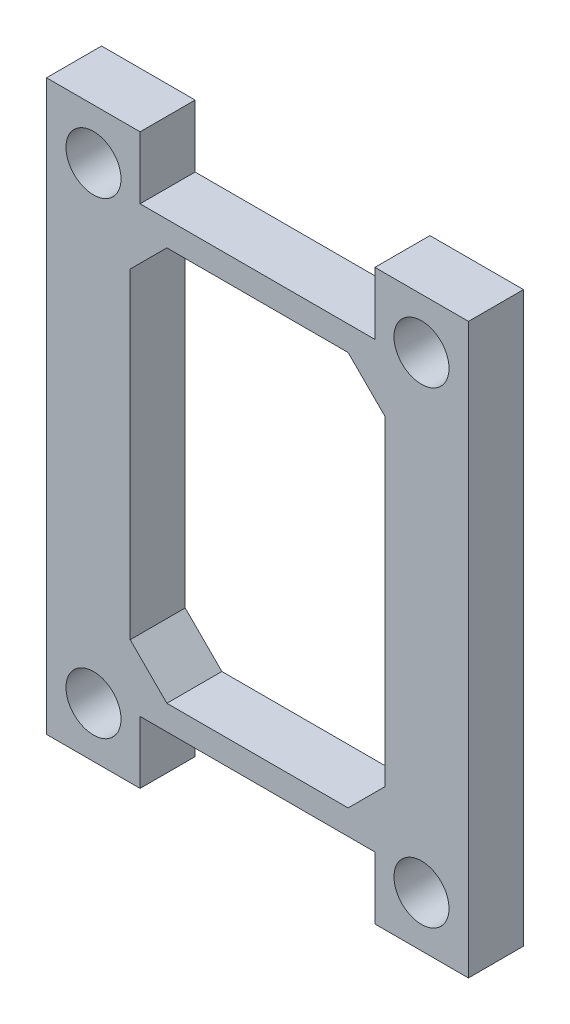
ISO-10303-21;
HEADER;
FILE_DESCRIPTION(('STEP AP214'),'2;1');
FILE_NAME('part.step','',(''),(''),'','','');
FILE_SCHEMA(('AUTOMOTIVE_DESIGN { 1 0 10303 214 1 1 1 1 }'));
ENDSEC;
DATA;
#1=APPLICATION_CONTEXT('core data for automotive mechanical design processes');
#2=APPLICATION_PROTOCOL_DEFINITION('international standard','automotive_design',2000,#1);
#3=PRODUCT_CONTEXT('',#1,'mechanical');
#4=PRODUCT('Part','Part','',(#3));
#5=PRODUCT_RELATED_PRODUCT_CATEGORY('part','',(#4));
#6=PRODUCT_DEFINITION_FORMATION('','',#4);
#7=PRODUCT_DEFINITION_CONTEXT('part definition',#1,'design');
#8=PRODUCT_DEFINITION('design','',#6,#7);
#9=PRODUCT_DEFINITION_SHAPE('','',#8);
#10=(LENGTH_UNIT() NAMED_UNIT(*) SI_UNIT(.MILLI.,.METRE.));
#11=(NAMED_UNIT(*) PLANE_ANGLE_UNIT() SI_UNIT($,.RADIAN.));
#12=(NAMED_UNIT(*) SI_UNIT($,.STERADIAN.) SOLID_ANGLE_UNIT());
#13=UNCERTAINTY_MEASURE_WITH_UNIT(LENGTH_MEASURE(1.E-05),#10,'distance_accuracy_value','');
#14=(GEOMETRIC_REPRESENTATION_CONTEXT(3) GLOBAL_UNCERTAINTY_ASSIGNED_CONTEXT((#13)) GLOBAL_UNIT_ASSIGNED_CONTEXT((#10,
#11,#12)) REPRESENTATION_CONTEXT('',''));
#15=CARTESIAN_POINT('',(0.,0.,0.));
#16=DIRECTION('',(0.,0.,1.));
#17=DIRECTION('',(1.,0.,0.));
#18=AXIS2_PLACEMENT_3D('',#15,#16,#17);
#19=CARTESIAN_POINT('',(11.5,-15.5,3.));
#20=DIRECTION('',(0.,0.,1.));
#21=DIRECTION('',(1.,0.,0.));
#22=AXIS2_PLACEMENT_3D('',#19,#20,#21);
#23=PLANE('',#22);
#24=DIRECTION('',(1.,0.,0.));
#25=VECTOR('',#24,1.);
#26=CARTESIAN_POINT('',(4.56,-4.75,3.));
#27=LINE('',#26,#25);
#28=CARTESIAN_POINT('',(6.56,-4.75,3.));
#29=VERTEX_POINT('',#28);
#30=CARTESIAN_POINT('',(16.44,-4.75,3.));
#31=VERTEX_POINT('',#30);
#32=EDGE_CURVE('E212',#29,#31,#27,.T.);
#33=ORIENTED_EDGE('',*,*,#32,.T.);
#34=DIRECTION('',(-0.707106781186548,0.707106781186548,0.));
#35=VECTOR('',#34,1.);
#36=CARTESIAN_POINT('',(18.3925,-6.7025,3.));
#37=LINE('',#36,#35);
#38=CARTESIAN_POINT('',(18.44,-6.75,3.));
#39=VERTEX_POINT('',#38);
#40=EDGE_CURVE('E238',#39,#31,#37,.T.);
#41=ORIENTED_EDGE('',*,*,#40,.F.);
#42=DIRECTION('',(0.,-1.,0.));
#43=VECTOR('',#42,1.);
#44=CARTESIAN_POINT('',(18.44,-4.75,3.));
#45=LINE('',#44,#43);
#46=CARTESIAN_POINT('',(18.44,-24.25,3.));
#47=VERTEX_POINT('',#46);
#48=EDGE_CURVE('E290',#39,#47,#45,.T.);
#49=ORIENTED_EDGE('',*,*,#48,.T.);
#50=DIRECTION('',(0.707106781186548,0.707106781186548,0.));
#51=VECTOR('',#50,1.);
#52=CARTESIAN_POINT('',(18.3925,-24.2975,3.));
#53=LINE('',#52,#51);
#54=CARTESIAN_POINT('',(16.44,-26.25,3.));
#55=VERTEX_POINT('',#54);
#56=EDGE_CURVE('E225',#55,#47,#53,.T.);
#57=ORIENTED_EDGE('',*,*,#56,.F.);
#58=DIRECTION('',(-1.,0.,0.));
#59=VECTOR('',#58,1.);
#60=CARTESIAN_POINT('',(18.44,-26.25,3.));
#61=LINE('',#60,#59);
#62=CARTESIAN_POINT('',(6.56,-26.25,3.));
#63=VERTEX_POINT('',#62);
#64=EDGE_CURVE('E224',#55,#63,#61,.T.);
#65=ORIENTED_EDGE('',*,*,#64,.T.);
#66=DIRECTION('',(0.707106781186547,-0.707106781186548,0.));
#67=VECTOR('',#66,1.);
#68=CARTESIAN_POINT('',(4.6075,-24.2975,3.));
#69=LINE('',#68,#67);
#70=CARTESIAN_POINT('',(4.56,-24.25,3.));
#71=VERTEX_POINT('',#70);
#72=EDGE_CURVE('E273',#71,#63,#69,.T.);
#73=ORIENTED_EDGE('',*,*,#72,.F.);
#74=DIRECTION('',(0.,1.,0.));
#75=VECTOR('',#74,1.);
#76=CARTESIAN_POINT('',(4.56,-26.25,3.));
#77=LINE('',#76,#75);
#78=CARTESIAN_POINT('',(4.56,-6.75,3.));
#79=VERTEX_POINT('',#78);
#80=EDGE_CURVE('E375',#71,#79,#77,.T.);
#81=ORIENTED_EDGE('',*,*,#80,.T.);
#82=DIRECTION('',(-0.707106781186548,-0.707106781186547,0.));
#83=VECTOR('',#82,1.);
#84=CARTESIAN_POINT('',(4.6075,-6.7025,3.));
#85=LINE('',#84,#83);
#86=EDGE_CURVE('E233',#29,#79,#85,.T.);
#87=ORIENTED_EDGE('',*,*,#86,.F.);
#88=EDGE_LOOP('',(#33,#41,#49,#57,#65,#73,#81,#87));
#89=FACE_BOUND('',#88,.T.);
#90=CARTESIAN_POINT('',(20.44,-28.25,3.));
#91=DIRECTION('',(0.,0.,-1.));
#92=DIRECTION('',(-1.,0.,0.));
#93=AXIS2_PLACEMENT_3D('',#90,#91,#92);
#94=CIRCLE('',#93,1.5);
#95=CARTESIAN_POINT('',(21.94,-28.25,3.));
#96=VERTEX_POINT('',#95);
#97=EDGE_CURVE('E90',#96,#96,#94,.T.);
#98=ORIENTED_EDGE('',*,*,#97,.T.);
#99=EDGE_LOOP('',(#98));
#100=FACE_BOUND('',#99,.T.);
#101=CARTESIAN_POINT('',(2.56,-28.25,3.));
#102=DIRECTION('',(0.,0.,-1.));
#103=DIRECTION('',(-1.,0.,0.));
#104=AXIS2_PLACEMENT_3D('',#101,#102,#103);
#105=CIRCLE('',#104,1.5);
#106=CARTESIAN_POINT('',(4.06,-28.25,3.));
#107=VERTEX_POINT('',#106);
#108=EDGE_CURVE('E84',#107,#107,#105,.T.);
#109=ORIENTED_EDGE('',*,*,#108,.T.);
#110=EDGE_LOOP('',(#109));
#111=FACE_BOUND('',#110,.T.);
#112=CARTESIAN_POINT('',(20.44,-2.75,3.));
#113=DIRECTION('',(0.,0.,-1.));
#114=DIRECTION('',(-1.,0.,0.));
#115=AXIS2_PLACEMENT_3D('',#112,#113,#114);
#116=CIRCLE('',#115,1.5);
#117=CARTESIAN_POINT('',(21.94,-2.75,3.));
#118=VERTEX_POINT('',#117);
#119=EDGE_CURVE('E243',#118,#118,#116,.T.);
#120=ORIENTED_EDGE('',*,*,#119,.T.);
#121=EDGE_LOOP('',(#120));
#122=FACE_BOUND('',#121,.T.);
#123=CARTESIAN_POINT('',(2.56,-2.75,3.));
#124=DIRECTION('',(0.,0.,-1.));
#125=DIRECTION('',(-1.,0.,0.));
#126=AXIS2_PLACEMENT_3D('',#123,#124,#125);
#127=CIRCLE('',#126,1.5);
#128=CARTESIAN_POINT('',(4.06,-2.75,3.));
#129=VERTEX_POINT('',#128);
#130=EDGE_CURVE('E35',#129,#129,#127,.T.);
#131=ORIENTED_EDGE('',*,*,#130,.T.);
#132=EDGE_LOOP('',(#131));
#133=FACE_BOUND('',#132,.T.);
#134=DIRECTION('',(0.,-1.,0.));
#135=VECTOR('',#134,1.);
#136=CARTESIAN_POINT('',(17.9,-21.55,3.));
#137=LINE('',#136,#135);
#138=CARTESIAN_POINT('',(17.9,-27.6,3.));
#139=VERTEX_POINT('',#138);
#140=CARTESIAN_POINT('',(17.9,-31.,3.));
#141=VERTEX_POINT('',#140);
#142=EDGE_CURVE('E194',#139,#141,#137,.T.);
#143=ORIENTED_EDGE('',*,*,#142,.T.);
#144=DIRECTION('',(1.,0.,0.));
#145=VECTOR('',#144,1.);
#146=CARTESIAN_POINT('',(0.,-31.,3.));
#147=LINE('',#146,#145);
#148=CARTESIAN_POINT('',(23.,-31.,3.));
#149=VERTEX_POINT('',#148);
#150=EDGE_CURVE('E192',#141,#149,#147,.T.);
#151=ORIENTED_EDGE('',*,*,#150,.T.);
#152=DIRECTION('',(0.,1.,0.));
#153=VECTOR('',#152,1.);
#154=CARTESIAN_POINT('',(23.,-31.,3.));
#155=LINE('',#154,#153);
#156=CARTESIAN_POINT('',(23.,0.,3.));
#157=VERTEX_POINT('',#156);
#158=EDGE_CURVE('E11',#149,#157,#155,.T.);
#159=ORIENTED_EDGE('',*,*,#158,.T.);
#160=DIRECTION('',(-1.,0.,0.));
#161=VECTOR('',#160,1.);
#162=CARTESIAN_POINT('',(23.,0.,3.));
#163=LINE('',#162,#161);
#164=CARTESIAN_POINT('',(17.9,0.,3.));
#165=VERTEX_POINT('',#164);
#166=EDGE_CURVE('E199',#157,#165,#163,.T.);
#167=ORIENTED_EDGE('',*,*,#166,.T.);
#168=DIRECTION('',(0.,-1.,0.));
#169=VECTOR('',#168,1.);
#170=CARTESIAN_POINT('',(17.9,-7.75,3.));
#171=LINE('',#170,#169);
#172=CARTESIAN_POINT('',(17.9,-3.4,3.));
#173=VERTEX_POINT('',#172);
#174=EDGE_CURVE('E303',#165,#173,#171,.T.);
#175=ORIENTED_EDGE('',*,*,#174,.T.);
#176=DIRECTION('',(-1.,0.,0.));
#177=VECTOR('',#176,1.);
#178=CARTESIAN_POINT('',(14.7,-3.4,3.));
#179=LINE('',#178,#177);
#180=CARTESIAN_POINT('',(5.1,-3.4,3.));
#181=VERTEX_POINT('',#180);
#182=EDGE_CURVE('E282',#173,#181,#179,.T.);
#183=ORIENTED_EDGE('',*,*,#182,.T.);
#184=DIRECTION('',(0.,1.,0.));
#185=VECTOR('',#184,1.);
#186=CARTESIAN_POINT('',(5.1,-9.45,3.));
#187=LINE('',#186,#185);
#188=CARTESIAN_POINT('',(5.1,0.,3.));
#189=VERTEX_POINT('',#188);
#190=EDGE_CURVE('E255',#181,#189,#187,.T.);
#191=ORIENTED_EDGE('',*,*,#190,.T.);
#192=DIRECTION('',(-1.,0.,0.));
#193=VECTOR('',#192,1.);
#194=CARTESIAN_POINT('',(23.,0.,3.));
#195=LINE('',#194,#193);
#196=CARTESIAN_POINT('',(0.,0.,3.));
#197=VERTEX_POINT('',#196);
#198=EDGE_CURVE('E305',#189,#197,#195,.T.);
#199=ORIENTED_EDGE('',*,*,#198,.T.);
#200=DIRECTION('',(0.,-1.,0.));
#201=VECTOR('',#200,1.);
#202=CARTESIAN_POINT('',(0.,0.,3.));
#203=LINE('',#202,#201);
#204=CARTESIAN_POINT('',(0.,-31.,3.));
#205=VERTEX_POINT('',#204);
#206=EDGE_CURVE('E28',#197,#205,#203,.T.);
#207=ORIENTED_EDGE('',*,*,#206,.T.);
#208=DIRECTION('',(1.,0.,0.));
#209=VECTOR('',#208,1.);
#210=CARTESIAN_POINT('',(0.,-31.,3.));
#211=LINE('',#210,#209);
#212=CARTESIAN_POINT('',(5.1,-31.,3.));
#213=VERTEX_POINT('',#212);
#214=EDGE_CURVE('E320',#205,#213,#211,.T.);
#215=ORIENTED_EDGE('',*,*,#214,.T.);
#216=DIRECTION('',(0.,1.,0.));
#217=VECTOR('',#216,1.);
#218=CARTESIAN_POINT('',(5.1,-23.25,3.));
#219=LINE('',#218,#217);
#220=CARTESIAN_POINT('',(5.1,-27.6,3.));
#221=VERTEX_POINT('',#220);
#222=EDGE_CURVE('E219',#213,#221,#219,.T.);
#223=ORIENTED_EDGE('',*,*,#222,.T.);
#224=DIRECTION('',(1.,0.,0.));
#225=VECTOR('',#224,1.);
#226=CARTESIAN_POINT('',(8.3,-27.6,3.));
#227=LINE('',#226,#225);
#228=EDGE_CURVE('E259',#221,#139,#227,.T.);
#229=ORIENTED_EDGE('',*,*,#228,.T.);
#230=EDGE_LOOP('',(#143,#151,#159,#167,#175,#183,#191,#199,#207,#215,#223,#229));
#231=FACE_BOUND('',#230,.T.);
#232=ADVANCED_FACE('F17',(#89,#100,#111,#122,#133,#231),#23,.T.);
#233=CARTESIAN_POINT('',(23.,-31.,0.));
#234=DIRECTION('',(1.,0.,0.));
#235=DIRECTION('',(0.,1.,0.));
#236=AXIS2_PLACEMENT_3D('',#233,#234,#235);
#237=PLANE('',#236);
#238=DIRECTION('',(0.,1.,0.));
#239=VECTOR('',#238,1.);
#240=CARTESIAN_POINT('',(23.,-31.,0.));
#241=LINE('',#240,#239);
#242=CARTESIAN_POINT('',(23.,-31.,0.));
#243=VERTEX_POINT('',#242);
#244=CARTESIAN_POINT('',(23.,0.,0.));
#245=VERTEX_POINT('',#244);
#246=EDGE_CURVE('E154',#243,#245,#241,.T.);
#247=ORIENTED_EDGE('',*,*,#246,.T.);
#248=DIRECTION('',(0.,0.,1.));
#249=VECTOR('',#248,1.);
#250=CARTESIAN_POINT('',(23.,0.,0.));
#251=LINE('',#250,#249);
#252=EDGE_CURVE('E188',#245,#157,#251,.T.);
#253=ORIENTED_EDGE('',*,*,#252,.T.);
#254=ORIENTED_EDGE('',*,*,#158,.F.);
#255=DIRECTION('',(0.,0.,1.));
#256=VECTOR('',#255,1.);
#257=CARTESIAN_POINT('',(23.,-31.,0.));
#258=LINE('',#257,#256);
#259=EDGE_CURVE('E185',#243,#149,#258,.T.);
#260=ORIENTED_EDGE('',*,*,#259,.F.);
#261=EDGE_LOOP('',(#247,#253,#254,#260));
#262=FACE_BOUND('',#261,.T.);
#263=ADVANCED_FACE('F183',(#262),#237,.T.);
#264=CARTESIAN_POINT('',(0.,0.,0.));
#265=DIRECTION('',(-1.,0.,0.));
#266=DIRECTION('',(0.,-1.,0.));
#267=AXIS2_PLACEMENT_3D('',#264,#265,#266);
#268=PLANE('',#267);
#269=DIRECTION('',(0.,-1.,0.));
#270=VECTOR('',#269,1.);
#271=CARTESIAN_POINT('',(0.,0.,0.));
#272=LINE('',#271,#270);
#273=CARTESIAN_POINT('',(0.,0.,0.));
#274=VERTEX_POINT('',#273);
#275=CARTESIAN_POINT('',(0.,-31.,0.));
#276=VERTEX_POINT('',#275);
#277=EDGE_CURVE('E160',#274,#276,#272,.T.);
#278=ORIENTED_EDGE('',*,*,#277,.T.);
#279=DIRECTION('',(0.,0.,1.));
#280=VECTOR('',#279,1.);
#281=CARTESIAN_POINT('',(0.,-31.,0.));
#282=LINE('',#281,#280);
#283=EDGE_CURVE('E323',#276,#205,#282,.T.);
#284=ORIENTED_EDGE('',*,*,#283,.T.);
#285=ORIENTED_EDGE('',*,*,#206,.F.);
#286=DIRECTION('',(0.,0.,1.));
#287=VECTOR('',#286,1.);
#288=CARTESIAN_POINT('',(0.,0.,0.));
#289=LINE('',#288,#287);
#290=EDGE_CURVE('E269',#274,#197,#289,.T.);
#291=ORIENTED_EDGE('',*,*,#290,.F.);
#292=EDGE_LOOP('',(#278,#284,#285,#291));
#293=FACE_BOUND('',#292,.T.);
#294=ADVANCED_FACE('F403',(#293),#268,.T.);
#295=CARTESIAN_POINT('',(2.56,-2.75,0.));
#296=DIRECTION('',(0.,0.,-1.));
#297=DIRECTION('',(-1.,0.,0.));
#298=AXIS2_PLACEMENT_3D('',#295,#296,#297);
#299=CYLINDRICAL_SURFACE('',#298,1.5);
#300=CARTESIAN_POINT('',(2.56,-2.75,0.));
#301=DIRECTION('',(0.,0.,-1.));
#302=DIRECTION('',(-1.,0.,0.));
#303=AXIS2_PLACEMENT_3D('',#300,#301,#302);
#304=CIRCLE('',#303,1.5);
#305=CARTESIAN_POINT('',(4.06,-2.75,0.));
#306=VERTEX_POINT('',#305);
#307=EDGE_CURVE('E237',#306,#306,#304,.T.);
#308=ORIENTED_EDGE('',*,*,#307,.T.);
#309=EDGE_LOOP('',(#308));
#310=FACE_BOUND('',#309,.T.);
#311=ORIENTED_EDGE('',*,*,#130,.F.);
#312=EDGE_LOOP('',(#311));
#313=FACE_BOUND('',#312,.T.);
#314=ADVANCED_FACE('F489',(#310,#313),#299,.F.);
#315=CARTESIAN_POINT('',(20.44,-2.75,0.));
#316=DIRECTION('',(0.,0.,-1.));
#317=DIRECTION('',(-1.,0.,0.));
#318=AXIS2_PLACEMENT_3D('',#315,#316,#317);
#319=CYLINDRICAL_SURFACE('',#318,1.5);
#320=CARTESIAN_POINT('',(20.44,-2.75,0.));
#321=DIRECTION('',(0.,0.,-1.));
#322=DIRECTION('',(-1.,0.,0.));
#323=AXIS2_PLACEMENT_3D('',#320,#321,#322);
#324=CIRCLE('',#323,1.5);
#325=CARTESIAN_POINT('',(21.94,-2.75,0.));
#326=VERTEX_POINT('',#325);
#327=EDGE_CURVE('E21',#326,#326,#324,.T.);
#328=ORIENTED_EDGE('',*,*,#327,.T.);
#329=EDGE_LOOP('',(#328));
#330=FACE_BOUND('',#329,.T.);
#331=ORIENTED_EDGE('',*,*,#119,.F.);
#332=EDGE_LOOP('',(#331));
#333=FACE_BOUND('',#332,.T.);
#334=ADVANCED_FACE('F492',(#330,#333),#319,.F.);
#335=CARTESIAN_POINT('',(2.56,-28.25,0.));
#336=DIRECTION('',(0.,0.,-1.));
#337=DIRECTION('',(-1.,0.,0.));
#338=AXIS2_PLACEMENT_3D('',#335,#336,#337);
#339=CYLINDRICAL_SURFACE('',#338,1.5);
#340=CARTESIAN_POINT('',(2.56,-28.25,0.));
#341=DIRECTION('',(0.,0.,-1.));
#342=DIRECTION('',(-1.,0.,0.));
#343=AXIS2_PLACEMENT_3D('',#340,#341,#342);
#344=CIRCLE('',#343,1.5);
#345=CARTESIAN_POINT('',(4.06,-28.25,0.));
#346=VERTEX_POINT('',#345);
#347=EDGE_CURVE('E310',#346,#346,#344,.T.);
#348=ORIENTED_EDGE('',*,*,#347,.T.);
#349=EDGE_LOOP('',(#348));
#350=FACE_BOUND('',#349,.T.);
#351=ORIENTED_EDGE('',*,*,#108,.F.);
#352=EDGE_LOOP('',(#351));
#353=FACE_BOUND('',#352,.T.);
#354=ADVANCED_FACE('F496',(#350,#353),#339,.F.);
#355=CARTESIAN_POINT('',(20.44,-28.25,0.));
#356=DIRECTION('',(0.,0.,-1.));
#357=DIRECTION('',(-1.,0.,0.));
#358=AXIS2_PLACEMENT_3D('',#355,#356,#357);
#359=CYLINDRICAL_SURFACE('',#358,1.5);
#360=CARTESIAN_POINT('',(20.44,-28.25,0.));
#361=DIRECTION('',(0.,0.,-1.));
#362=DIRECTION('',(-1.,0.,0.));
#363=AXIS2_PLACEMENT_3D('',#360,#361,#362);
#364=CIRCLE('',#363,1.5);
#365=CARTESIAN_POINT('',(21.94,-28.25,0.));
#366=VERTEX_POINT('',#365);
#367=EDGE_CURVE('E309',#366,#366,#364,.T.);
#368=ORIENTED_EDGE('',*,*,#367,.T.);
#369=EDGE_LOOP('',(#368));
#370=FACE_BOUND('',#369,.T.);
#371=ORIENTED_EDGE('',*,*,#97,.F.);
#372=EDGE_LOOP('',(#371));
#373=FACE_BOUND('',#372,.T.);
#374=ADVANCED_FACE('F511',(#370,#373),#359,.F.);
#375=CARTESIAN_POINT('',(11.5,-15.5,0.));
#376=DIRECTION('',(0.,0.,1.));
#377=DIRECTION('',(1.,0.,0.));
#378=AXIS2_PLACEMENT_3D('',#375,#376,#377);
#379=PLANE('',#378);
#380=DIRECTION('',(0.,1.,0.));
#381=VECTOR('',#380,1.);
#382=CARTESIAN_POINT('',(17.9,-21.55,0.));
#383=LINE('',#382,#381);
#384=CARTESIAN_POINT('',(17.9,-31.,0.));
#385=VERTEX_POINT('',#384);
#386=CARTESIAN_POINT('',(17.9,-27.6,0.));
#387=VERTEX_POINT('',#386);
#388=EDGE_CURVE('E289',#385,#387,#383,.T.);
#389=ORIENTED_EDGE('',*,*,#388,.T.);
#390=DIRECTION('',(-1.,0.,0.));
#391=VECTOR('',#390,1.);
#392=CARTESIAN_POINT('',(8.3,-27.6,0.));
#393=LINE('',#392,#391);
#394=CARTESIAN_POINT('',(5.1,-27.6,0.));
#395=VERTEX_POINT('',#394);
#396=EDGE_CURVE('E316',#387,#395,#393,.T.);
#397=ORIENTED_EDGE('',*,*,#396,.T.);
#398=DIRECTION('',(0.,-1.,0.));
#399=VECTOR('',#398,1.);
#400=CARTESIAN_POINT('',(5.1,-23.25,0.));
#401=LINE('',#400,#399);
#402=CARTESIAN_POINT('',(5.1,-31.,0.));
#403=VERTEX_POINT('',#402);
#404=EDGE_CURVE('E218',#395,#403,#401,.T.);
#405=ORIENTED_EDGE('',*,*,#404,.T.);
#406=DIRECTION('',(1.,0.,0.));
#407=VECTOR('',#406,1.);
#408=CARTESIAN_POINT('',(0.,-31.,0.));
#409=LINE('',#408,#407);
#410=EDGE_CURVE('E209',#276,#403,#409,.T.);
#411=ORIENTED_EDGE('',*,*,#410,.F.);
#412=ORIENTED_EDGE('',*,*,#277,.F.);
#413=DIRECTION('',(-1.,0.,0.));
#414=VECTOR('',#413,1.);
#415=CARTESIAN_POINT('',(23.,0.,0.));
#416=LINE('',#415,#414);
#417=CARTESIAN_POINT('',(5.1,0.,0.));
#418=VERTEX_POINT('',#417);
#419=EDGE_CURVE('E265',#418,#274,#416,.T.);
#420=ORIENTED_EDGE('',*,*,#419,.F.);
#421=DIRECTION('',(0.,-1.,0.));
#422=VECTOR('',#421,1.);
#423=CARTESIAN_POINT('',(5.1,-9.45,0.));
#424=LINE('',#423,#422);
#425=CARTESIAN_POINT('',(5.1,-3.4,0.));
#426=VERTEX_POINT('',#425);
#427=EDGE_CURVE('E254',#418,#426,#424,.T.);
#428=ORIENTED_EDGE('',*,*,#427,.T.);
#429=DIRECTION('',(1.,0.,0.));
#430=VECTOR('',#429,1.);
#431=CARTESIAN_POINT('',(14.7,-3.4,0.));
#432=LINE('',#431,#430);
#433=CARTESIAN_POINT('',(17.9,-3.4,0.));
#434=VERTEX_POINT('',#433);
#435=EDGE_CURVE('E300',#426,#434,#432,.T.);
#436=ORIENTED_EDGE('',*,*,#435,.T.);
#437=DIRECTION('',(0.,1.,0.));
#438=VECTOR('',#437,1.);
#439=CARTESIAN_POINT('',(17.9,-7.75,0.));
#440=LINE('',#439,#438);
#441=CARTESIAN_POINT('',(17.9,0.,0.));
#442=VERTEX_POINT('',#441);
#443=EDGE_CURVE('E324',#434,#442,#440,.T.);
#444=ORIENTED_EDGE('',*,*,#443,.T.);
#445=DIRECTION('',(-1.,0.,0.));
#446=VECTOR('',#445,1.);
#447=CARTESIAN_POINT('',(23.,0.,0.));
#448=LINE('',#447,#446);
#449=EDGE_CURVE('E270',#245,#442,#448,.T.);
#450=ORIENTED_EDGE('',*,*,#449,.F.);
#451=ORIENTED_EDGE('',*,*,#246,.F.);
#452=DIRECTION('',(1.,0.,0.));
#453=VECTOR('',#452,1.);
#454=CARTESIAN_POINT('',(0.,-31.,0.));
#455=LINE('',#454,#453);
#456=EDGE_CURVE('E202',#385,#243,#455,.T.);
#457=ORIENTED_EDGE('',*,*,#456,.F.);
#458=EDGE_LOOP('',(#389,#397,#405,#411,#412,#420,#428,#436,#444,#450,#451,#457));
#459=FACE_BOUND('',#458,.T.);
#460=ORIENTED_EDGE('',*,*,#307,.F.);
#461=EDGE_LOOP('',(#460));
#462=FACE_BOUND('',#461,.T.);
#463=ORIENTED_EDGE('',*,*,#327,.F.);
#464=EDGE_LOOP('',(#463));
#465=FACE_BOUND('',#464,.T.);
#466=ORIENTED_EDGE('',*,*,#347,.F.);
#467=EDGE_LOOP('',(#466));
#468=FACE_BOUND('',#467,.T.);
#469=ORIENTED_EDGE('',*,*,#367,.F.);
#470=EDGE_LOOP('',(#469));
#471=FACE_BOUND('',#470,.T.);
#472=DIRECTION('',(0.707106781186548,0.707106781186547,0.));
#473=VECTOR('',#472,1.);
#474=CARTESIAN_POINT('',(4.6075,-6.7025,0.));
#475=LINE('',#474,#473);
#476=CARTESIAN_POINT('',(4.56,-6.75,0.));
#477=VERTEX_POINT('',#476);
#478=CARTESIAN_POINT('',(6.56,-4.75,0.));
#479=VERTEX_POINT('',#478);
#480=EDGE_CURVE('E234',#477,#479,#475,.T.);
#481=ORIENTED_EDGE('',*,*,#480,.F.);
#482=DIRECTION('',(0.,1.,0.));
#483=VECTOR('',#482,1.);
#484=CARTESIAN_POINT('',(4.56,-26.25,0.));
#485=LINE('',#484,#483);
#486=CARTESIAN_POINT('',(4.56,-24.25,0.));
#487=VERTEX_POINT('',#486);
#488=EDGE_CURVE('E274',#487,#477,#485,.T.);
#489=ORIENTED_EDGE('',*,*,#488,.F.);
#490=DIRECTION('',(-0.707106781186547,0.707106781186548,0.));
#491=VECTOR('',#490,1.);
#492=CARTESIAN_POINT('',(4.6075,-24.2975,0.));
#493=LINE('',#492,#491);
#494=CARTESIAN_POINT('',(6.56,-26.25,0.));
#495=VERTEX_POINT('',#494);
#496=EDGE_CURVE('E220',#495,#487,#493,.T.);
#497=ORIENTED_EDGE('',*,*,#496,.F.);
#498=DIRECTION('',(-1.,0.,0.));
#499=VECTOR('',#498,1.);
#500=CARTESIAN_POINT('',(18.44,-26.25,0.));
#501=LINE('',#500,#499);
#502=CARTESIAN_POINT('',(16.44,-26.25,0.));
#503=VERTEX_POINT('',#502);
#504=EDGE_CURVE('E249',#503,#495,#501,.T.);
#505=ORIENTED_EDGE('',*,*,#504,.F.);
#506=DIRECTION('',(-0.707106781186548,-0.707106781186548,0.));
#507=VECTOR('',#506,1.);
#508=CARTESIAN_POINT('',(18.3925,-24.2975,0.));
#509=LINE('',#508,#507);
#510=CARTESIAN_POINT('',(18.44,-24.25,0.));
#511=VERTEX_POINT('',#510);
#512=EDGE_CURVE('E258',#511,#503,#509,.T.);
#513=ORIENTED_EDGE('',*,*,#512,.F.);
#514=DIRECTION('',(0.,-1.,0.));
#515=VECTOR('',#514,1.);
#516=CARTESIAN_POINT('',(18.44,-4.75,0.));
#517=LINE('',#516,#515);
#518=CARTESIAN_POINT('',(18.44,-6.75,0.));
#519=VERTEX_POINT('',#518);
#520=EDGE_CURVE('E294',#519,#511,#517,.T.);
#521=ORIENTED_EDGE('',*,*,#520,.F.);
#522=DIRECTION('',(0.707106781186548,-0.707106781186548,0.));
#523=VECTOR('',#522,1.);
#524=CARTESIAN_POINT('',(18.3925,-6.7025,0.));
#525=LINE('',#524,#523);
#526=CARTESIAN_POINT('',(16.44,-4.75,0.));
#527=VERTEX_POINT('',#526);
#528=EDGE_CURVE('E299',#527,#519,#525,.T.);
#529=ORIENTED_EDGE('',*,*,#528,.F.);
#530=DIRECTION('',(1.,0.,0.));
#531=VECTOR('',#530,1.);
#532=CARTESIAN_POINT('',(4.56,-4.75,0.));
#533=LINE('',#532,#531);
#534=EDGE_CURVE('E285',#479,#527,#533,.T.);
#535=ORIENTED_EDGE('',*,*,#534,.F.);
#536=EDGE_LOOP('',(#481,#489,#497,#505,#513,#521,#529,#535));
#537=FACE_BOUND('',#536,.T.);
#538=ADVANCED_FACE('F19',(#459,#462,#465,#468,#471,#537),#379,.F.);
#539=CARTESIAN_POINT('',(23.,0.,0.));
#540=DIRECTION('',(0.,1.,0.));
#541=DIRECTION('',(-1.,0.,0.));
#542=AXIS2_PLACEMENT_3D('',#539,#540,#541);
#543=PLANE('',#542);
#544=DIRECTION('',(0.,0.,-1.));
#545=VECTOR('',#544,1.);
#546=CARTESIAN_POINT('',(5.1,0.,1.5));
#547=LINE('',#546,#545);
#548=EDGE_CURVE('E279',#189,#418,#547,.T.);
#549=ORIENTED_EDGE('',*,*,#548,.T.);
#550=ORIENTED_EDGE('',*,*,#419,.T.);
#551=ORIENTED_EDGE('',*,*,#290,.T.);
#552=ORIENTED_EDGE('',*,*,#198,.F.);
#553=EDGE_LOOP('',(#549,#550,#551,#552));
#554=FACE_BOUND('',#553,.T.);
#555=ADVANCED_FACE('F399',(#554),#543,.T.);
#556=CARTESIAN_POINT('',(23.,0.,0.));
#557=DIRECTION('',(0.,1.,0.));
#558=DIRECTION('',(-1.,0.,0.));
#559=AXIS2_PLACEMENT_3D('',#556,#557,#558);
#560=PLANE('',#559);
#561=DIRECTION('',(0.,0.,1.));
#562=VECTOR('',#561,1.);
#563=CARTESIAN_POINT('',(17.9,0.,1.5));
#564=LINE('',#563,#562);
#565=EDGE_CURVE('E331',#442,#165,#564,.T.);
#566=ORIENTED_EDGE('',*,*,#565,.T.);
#567=ORIENTED_EDGE('',*,*,#166,.F.);
#568=ORIENTED_EDGE('',*,*,#252,.F.);
#569=ORIENTED_EDGE('',*,*,#449,.T.);
#570=EDGE_LOOP('',(#566,#567,#568,#569));
#571=FACE_BOUND('',#570,.T.);
#572=ADVANCED_FACE('F385',(#571),#560,.T.);
#573=CARTESIAN_POINT('',(0.,-31.,0.));
#574=DIRECTION('',(0.,-1.,0.));
#575=DIRECTION('',(1.,0.,0.));
#576=AXIS2_PLACEMENT_3D('',#573,#574,#575);
#577=PLANE('',#576);
#578=DIRECTION('',(0.,0.,-1.));
#579=VECTOR('',#578,1.);
#580=CARTESIAN_POINT('',(17.9,-31.,1.5));
#581=LINE('',#580,#579);
#582=EDGE_CURVE('E262',#141,#385,#581,.T.);
#583=ORIENTED_EDGE('',*,*,#582,.T.);
#584=ORIENTED_EDGE('',*,*,#456,.T.);
#585=ORIENTED_EDGE('',*,*,#259,.T.);
#586=ORIENTED_EDGE('',*,*,#150,.F.);
#587=EDGE_LOOP('',(#583,#584,#585,#586));
#588=FACE_BOUND('',#587,.T.);
#589=ADVANCED_FACE('F201',(#588),#577,.T.);
#590=CARTESIAN_POINT('',(0.,-31.,0.));
#591=DIRECTION('',(0.,-1.,0.));
#592=DIRECTION('',(1.,0.,0.));
#593=AXIS2_PLACEMENT_3D('',#590,#591,#592);
#594=PLANE('',#593);
#595=DIRECTION('',(0.,0.,1.));
#596=VECTOR('',#595,1.);
#597=CARTESIAN_POINT('',(5.1,-31.,1.5));
#598=LINE('',#597,#596);
#599=EDGE_CURVE('E215',#403,#213,#598,.T.);
#600=ORIENTED_EDGE('',*,*,#599,.T.);
#601=ORIENTED_EDGE('',*,*,#214,.F.);
#602=ORIENTED_EDGE('',*,*,#283,.F.);
#603=ORIENTED_EDGE('',*,*,#410,.T.);
#604=EDGE_LOOP('',(#600,#601,#602,#603));
#605=FACE_BOUND('',#604,.T.);
#606=ADVANCED_FACE('F405',(#605),#594,.T.);
#607=CARTESIAN_POINT('',(17.9,0.,3.));
#608=DIRECTION('',(1.,0.,0.));
#609=DIRECTION('',(0.,-1.,0.));
#610=AXIS2_PLACEMENT_3D('',#607,#608,#609);
#611=PLANE('',#610);
#612=ORIENTED_EDGE('',*,*,#174,.F.);
#613=ORIENTED_EDGE('',*,*,#565,.F.);
#614=ORIENTED_EDGE('',*,*,#443,.F.);
#615=DIRECTION('',(0.,0.,-1.));
#616=VECTOR('',#615,1.);
#617=CARTESIAN_POINT('',(17.9,-3.4,3.));
#618=LINE('',#617,#616);
#619=EDGE_CURVE('E304',#173,#434,#618,.T.);
#620=ORIENTED_EDGE('',*,*,#619,.F.);
#621=EDGE_LOOP('',(#612,#613,#614,#620));
#622=FACE_BOUND('',#621,.T.);
#623=ADVANCED_FACE('F388',(#622),#611,.F.);
#624=CARTESIAN_POINT('',(17.9,-3.4,3.));
#625=DIRECTION('',(0.,-1.,0.));
#626=DIRECTION('',(-1.,0.,0.));
#627=AXIS2_PLACEMENT_3D('',#624,#625,#626);
#628=PLANE('',#627);
#629=ORIENTED_EDGE('',*,*,#182,.F.);
#630=ORIENTED_EDGE('',*,*,#619,.T.);
#631=ORIENTED_EDGE('',*,*,#435,.F.);
#632=DIRECTION('',(0.,0.,-1.));
#633=VECTOR('',#632,1.);
#634=CARTESIAN_POINT('',(5.1,-3.4,3.));
#635=LINE('',#634,#633);
#636=EDGE_CURVE('E250',#181,#426,#635,.T.);
#637=ORIENTED_EDGE('',*,*,#636,.F.);
#638=EDGE_LOOP('',(#629,#630,#631,#637));
#639=FACE_BOUND('',#638,.T.);
#640=ADVANCED_FACE('F393',(#639),#628,.F.);
#641=CARTESIAN_POINT('',(5.1,-3.4,3.));
#642=DIRECTION('',(-1.,0.,0.));
#643=DIRECTION('',(0.,1.,0.));
#644=AXIS2_PLACEMENT_3D('',#641,#642,#643);
#645=PLANE('',#644);
#646=ORIENTED_EDGE('',*,*,#190,.F.);
#647=ORIENTED_EDGE('',*,*,#636,.T.);
#648=ORIENTED_EDGE('',*,*,#427,.F.);
#649=ORIENTED_EDGE('',*,*,#548,.F.);
#650=EDGE_LOOP('',(#646,#647,#648,#649));
#651=FACE_BOUND('',#650,.T.);
#652=ADVANCED_FACE('F397',(#651),#645,.F.);
#653=CARTESIAN_POINT('',(5.1,-31.,3.));
#654=DIRECTION('',(-1.,0.,0.));
#655=DIRECTION('',(0.,1.,0.));
#656=AXIS2_PLACEMENT_3D('',#653,#654,#655);
#657=PLANE('',#656);
#658=ORIENTED_EDGE('',*,*,#222,.F.);
#659=ORIENTED_EDGE('',*,*,#599,.F.);
#660=ORIENTED_EDGE('',*,*,#404,.F.);
#661=DIRECTION('',(0.,0.,-1.));
#662=VECTOR('',#661,1.);
#663=CARTESIAN_POINT('',(5.1,-27.6,3.));
#664=LINE('',#663,#662);
#665=EDGE_CURVE('E261',#221,#395,#664,.T.);
#666=ORIENTED_EDGE('',*,*,#665,.F.);
#667=EDGE_LOOP('',(#658,#659,#660,#666));
#668=FACE_BOUND('',#667,.T.);
#669=ADVANCED_FACE('F411',(#668),#657,.F.);
#670=CARTESIAN_POINT('',(5.1,-27.6,3.));
#671=DIRECTION('',(0.,1.,0.));
#672=DIRECTION('',(1.,0.,0.));
#673=AXIS2_PLACEMENT_3D('',#670,#671,#672);
#674=PLANE('',#673);
#675=ORIENTED_EDGE('',*,*,#228,.F.);
#676=ORIENTED_EDGE('',*,*,#665,.T.);
#677=ORIENTED_EDGE('',*,*,#396,.F.);
#678=DIRECTION('',(0.,0.,-1.));
#679=VECTOR('',#678,1.);
#680=CARTESIAN_POINT('',(17.9,-27.6,3.));
#681=LINE('',#680,#679);
#682=EDGE_CURVE('E284',#139,#387,#681,.T.);
#683=ORIENTED_EDGE('',*,*,#682,.F.);
#684=EDGE_LOOP('',(#675,#676,#677,#683));
#685=FACE_BOUND('',#684,.T.);
#686=ADVANCED_FACE('F415',(#685),#674,.F.);
#687=CARTESIAN_POINT('',(17.9,-27.6,3.));
#688=DIRECTION('',(1.,0.,0.));
#689=DIRECTION('',(0.,-1.,0.));
#690=AXIS2_PLACEMENT_3D('',#687,#688,#689);
#691=PLANE('',#690);
#692=ORIENTED_EDGE('',*,*,#142,.F.);
#693=ORIENTED_EDGE('',*,*,#682,.T.);
#694=ORIENTED_EDGE('',*,*,#388,.F.);
#695=ORIENTED_EDGE('',*,*,#582,.F.);
#696=EDGE_LOOP('',(#692,#693,#694,#695));
#697=FACE_BOUND('',#696,.T.);
#698=ADVANCED_FACE('F418',(#697),#691,.F.);
#699=CARTESIAN_POINT('',(4.56,-4.75,0.));
#700=DIRECTION('',(0.,-1.,0.));
#701=DIRECTION('',(1.,0.,0.));
#702=AXIS2_PLACEMENT_3D('',#699,#700,#701);
#703=PLANE('',#702);
#704=DIRECTION('',(0.,0.,-1.));
#705=VECTOR('',#704,1.);
#706=CARTESIAN_POINT('',(16.44,-4.75,0.));
#707=LINE('',#706,#705);
#708=EDGE_CURVE('E241',#31,#527,#707,.T.);
#709=ORIENTED_EDGE('',*,*,#708,.F.);
#710=ORIENTED_EDGE('',*,*,#32,.F.);
#711=DIRECTION('',(0.,0.,1.));
#712=VECTOR('',#711,1.);
#713=CARTESIAN_POINT('',(6.56,-4.75,0.));
#714=LINE('',#713,#712);
#715=EDGE_CURVE('E230',#479,#29,#714,.T.);
#716=ORIENTED_EDGE('',*,*,#715,.F.);
#717=ORIENTED_EDGE('',*,*,#534,.T.);
#718=EDGE_LOOP('',(#709,#710,#716,#717));
#719=FACE_BOUND('',#718,.T.);
#720=ADVANCED_FACE('F465',(#719),#703,.T.);
#721=CARTESIAN_POINT('',(5.56,-5.75,0.));
#722=DIRECTION('',(0.707106781186547,-0.707106781186548,0.));
#723=DIRECTION('',(0.,0.,-1.));
#724=AXIS2_PLACEMENT_3D('',#721,#722,#723);
#725=PLANE('',#724);
#726=ORIENTED_EDGE('',*,*,#480,.T.);
#727=ORIENTED_EDGE('',*,*,#715,.T.);
#728=ORIENTED_EDGE('',*,*,#86,.T.);
#729=DIRECTION('',(0.,0.,-1.));
#730=VECTOR('',#729,1.);
#731=CARTESIAN_POINT('',(4.56,-6.75,0.));
#732=LINE('',#731,#730);
#733=EDGE_CURVE('E278',#79,#477,#732,.T.);
#734=ORIENTED_EDGE('',*,*,#733,.T.);
#735=EDGE_LOOP('',(#726,#727,#728,#734));
#736=FACE_BOUND('',#735,.T.);
#737=ADVANCED_FACE('F433',(#736),#725,.T.);
#738=CARTESIAN_POINT('',(18.44,-4.75,0.));
#739=DIRECTION('',(-1.,0.,0.));
#740=DIRECTION('',(0.,-1.,0.));
#741=AXIS2_PLACEMENT_3D('',#738,#739,#740);
#742=PLANE('',#741);
#743=DIRECTION('',(0.,0.,-1.));
#744=VECTOR('',#743,1.);
#745=CARTESIAN_POINT('',(18.44,-24.25,0.));
#746=LINE('',#745,#744);
#747=EDGE_CURVE('E228',#47,#511,#746,.T.);
#748=ORIENTED_EDGE('',*,*,#747,.F.);
#749=ORIENTED_EDGE('',*,*,#48,.F.);
#750=DIRECTION('',(0.,0.,1.));
#751=VECTOR('',#750,1.);
#752=CARTESIAN_POINT('',(18.44,-6.75,0.));
#753=LINE('',#752,#751);
#754=EDGE_CURVE('E242',#519,#39,#753,.T.);
#755=ORIENTED_EDGE('',*,*,#754,.F.);
#756=ORIENTED_EDGE('',*,*,#520,.T.);
#757=EDGE_LOOP('',(#748,#749,#755,#756));
#758=FACE_BOUND('',#757,.T.);
#759=ADVANCED_FACE('F458',(#758),#742,.T.);
#760=CARTESIAN_POINT('',(17.44,-5.75,0.));
#761=DIRECTION('',(-0.707106781186548,-0.707106781186548,0.));
#762=DIRECTION('',(0.,0.,1.));
#763=AXIS2_PLACEMENT_3D('',#760,#761,#762);
#764=PLANE('',#763);
#765=ORIENTED_EDGE('',*,*,#528,.T.);
#766=ORIENTED_EDGE('',*,*,#754,.T.);
#767=ORIENTED_EDGE('',*,*,#40,.T.);
#768=ORIENTED_EDGE('',*,*,#708,.T.);
#769=EDGE_LOOP('',(#765,#766,#767,#768));
#770=FACE_BOUND('',#769,.T.);
#771=ADVANCED_FACE('F462',(#770),#764,.T.);
#772=CARTESIAN_POINT('',(4.56,-26.25,0.));
#773=DIRECTION('',(1.,0.,0.));
#774=DIRECTION('',(0.,1.,0.));
#775=AXIS2_PLACEMENT_3D('',#772,#773,#774);
#776=PLANE('',#775);
#777=DIRECTION('',(0.,0.,1.));
#778=VECTOR('',#777,1.);
#779=CARTESIAN_POINT('',(4.56,-24.25,0.));
#780=LINE('',#779,#778);
#781=EDGE_CURVE('E223',#487,#71,#780,.T.);
#782=ORIENTED_EDGE('',*,*,#781,.F.);
#783=ORIENTED_EDGE('',*,*,#488,.T.);
#784=ORIENTED_EDGE('',*,*,#733,.F.);
#785=ORIENTED_EDGE('',*,*,#80,.F.);
#786=EDGE_LOOP('',(#782,#783,#784,#785));
#787=FACE_BOUND('',#786,.T.);
#788=ADVANCED_FACE('F439',(#787),#776,.T.);
#789=CARTESIAN_POINT('',(5.56,-25.25,0.));
#790=DIRECTION('',(0.707106781186548,0.707106781186547,0.));
#791=DIRECTION('',(0.,0.,-1.));
#792=AXIS2_PLACEMENT_3D('',#789,#790,#791);
#793=PLANE('',#792);
#794=ORIENTED_EDGE('',*,*,#496,.T.);
#795=ORIENTED_EDGE('',*,*,#781,.T.);
#796=ORIENTED_EDGE('',*,*,#72,.T.);
#797=DIRECTION('',(0.,0.,-1.));
#798=VECTOR('',#797,1.);
#799=CARTESIAN_POINT('',(6.56,-26.25,0.));
#800=LINE('',#799,#798);
#801=EDGE_CURVE('E246',#63,#495,#800,.T.);
#802=ORIENTED_EDGE('',*,*,#801,.T.);
#803=EDGE_LOOP('',(#794,#795,#796,#802));
#804=FACE_BOUND('',#803,.T.);
#805=ADVANCED_FACE('F447',(#804),#793,.T.);
#806=CARTESIAN_POINT('',(18.44,-26.25,0.));
#807=DIRECTION('',(0.,1.,0.));
#808=DIRECTION('',(-1.,0.,0.));
#809=AXIS2_PLACEMENT_3D('',#806,#807,#808);
#810=PLANE('',#809);
#811=DIRECTION('',(0.,0.,1.));
#812=VECTOR('',#811,1.);
#813=CARTESIAN_POINT('',(16.44,-26.25,0.));
#814=LINE('',#813,#812);
#815=EDGE_CURVE('E229',#503,#55,#814,.T.);
#816=ORIENTED_EDGE('',*,*,#815,.F.);
#817=ORIENTED_EDGE('',*,*,#504,.T.);
#818=ORIENTED_EDGE('',*,*,#801,.F.);
#819=ORIENTED_EDGE('',*,*,#64,.F.);
#820=EDGE_LOOP('',(#816,#817,#818,#819));
#821=FACE_BOUND('',#820,.T.);
#822=ADVANCED_FACE('F450',(#821),#810,.T.);
#823=CARTESIAN_POINT('',(17.44,-25.25,0.));
#824=DIRECTION('',(-0.707106781186548,0.707106781186548,0.));
#825=DIRECTION('',(0.,0.,1.));
#826=AXIS2_PLACEMENT_3D('',#823,#824,#825);
#827=PLANE('',#826);
#828=ORIENTED_EDGE('',*,*,#512,.T.);
#829=ORIENTED_EDGE('',*,*,#815,.T.);
#830=ORIENTED_EDGE('',*,*,#56,.T.);
#831=ORIENTED_EDGE('',*,*,#747,.T.);
#832=EDGE_LOOP('',(#828,#829,#830,#831));
#833=FACE_BOUND('',#832,.T.);
#834=ADVANCED_FACE('F455',(#833),#827,.T.);
#835=CLOSED_SHELL('',(#232,#263,#294,#314,#334,#354,#374,#538,#555,#572,#589,#606,#623,#640,
#652,#669,#686,#698,#720,#737,#759,#771,#788,#805,#822,#834));
#836=MANIFOLD_SOLID_BREP('B1',#835);
#837=ADVANCED_BREP_SHAPE_REPRESENTATION('',(#18,#836),#14);
#838=SHAPE_DEFINITION_REPRESENTATION(#9,#837);
ENDSEC;
END-ISO-10303-21;
